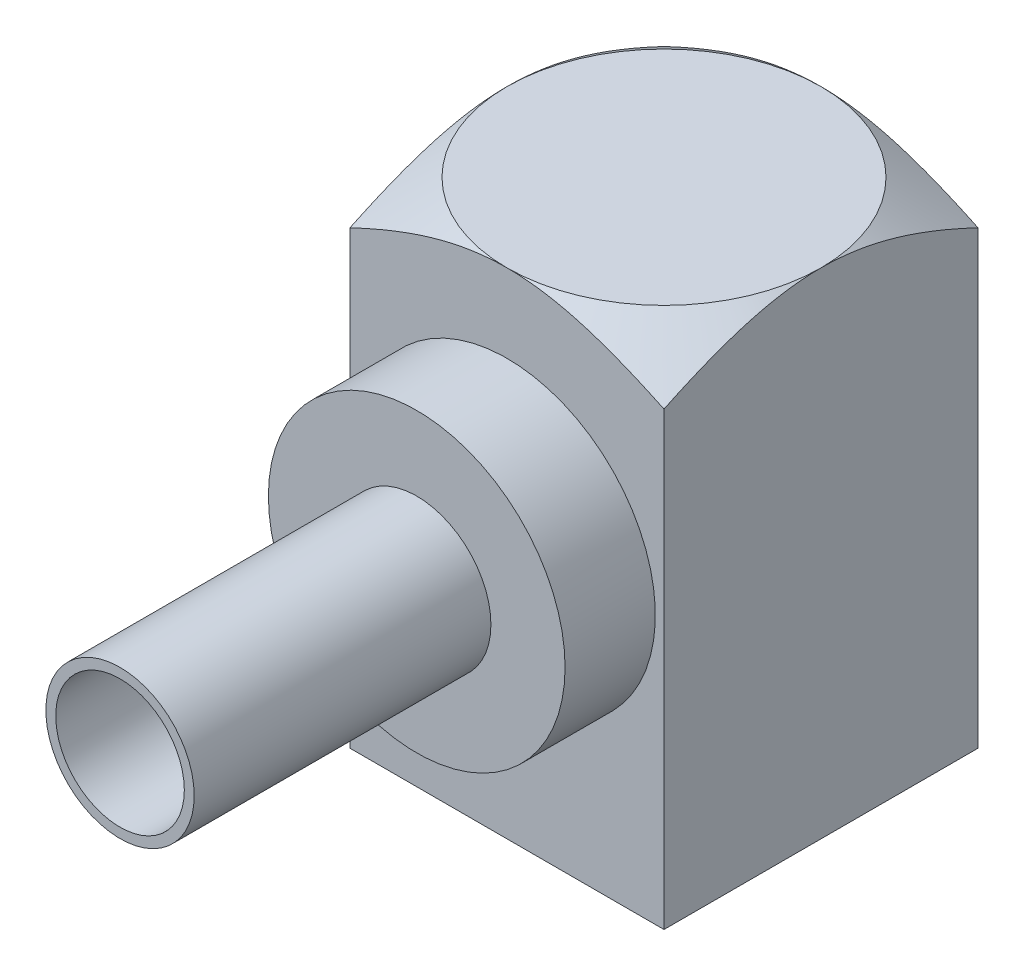
ISO-10303-21;
HEADER;
FILE_DESCRIPTION(('STEP AP214'),'2;1');
FILE_NAME('part.step','',(''),(''),'','','');
FILE_SCHEMA(('AUTOMOTIVE_DESIGN { 1 0 10303 214 1 1 1 1 }'));
ENDSEC;
DATA;
#1=APPLICATION_CONTEXT('core data for automotive mechanical design processes');
#2=APPLICATION_PROTOCOL_DEFINITION('international standard','automotive_design',2000,#1);
#3=PRODUCT_CONTEXT('',#1,'mechanical');
#4=PRODUCT('Part','Part','',(#3));
#5=PRODUCT_RELATED_PRODUCT_CATEGORY('part','',(#4));
#6=PRODUCT_DEFINITION_FORMATION('','',#4);
#7=PRODUCT_DEFINITION_CONTEXT('part definition',#1,'design');
#8=PRODUCT_DEFINITION('design','',#6,#7);
#9=PRODUCT_DEFINITION_SHAPE('','',#8);
#10=(LENGTH_UNIT() NAMED_UNIT(*) SI_UNIT(.MILLI.,.METRE.));
#11=(NAMED_UNIT(*) PLANE_ANGLE_UNIT() SI_UNIT($,.RADIAN.));
#12=(NAMED_UNIT(*) SI_UNIT($,.STERADIAN.) SOLID_ANGLE_UNIT());
#13=UNCERTAINTY_MEASURE_WITH_UNIT(LENGTH_MEASURE(1.E-05),#10,'distance_accuracy_value','');
#14=(GEOMETRIC_REPRESENTATION_CONTEXT(3) GLOBAL_UNCERTAINTY_ASSIGNED_CONTEXT((#13)) GLOBAL_UNIT_ASSIGNED_CONTEXT((#10,
#11,#12)) REPRESENTATION_CONTEXT('',''));
#15=CARTESIAN_POINT('',(0.,0.,0.));
#16=DIRECTION('',(0.,0.,1.));
#17=DIRECTION('',(1.,0.,0.));
#18=AXIS2_PLACEMENT_3D('',#15,#16,#17);
#19=CARTESIAN_POINT('',(0.,5.41672008937326,5.));
#20=DIRECTION('',(0.,0.,1.));
#21=DIRECTION('',(1.,0.,0.));
#22=AXIS2_PLACEMENT_3D('',#19,#20,#21);
#23=PLANE('',#22);
#24=CARTESIAN_POINT('',(0.,5.41672008937326,5.));
#25=DIRECTION('',(0.,0.,1.));
#26=DIRECTION('',(1.,0.,0.));
#27=AXIS2_PLACEMENT_3D('',#24,#25,#26);
#28=CIRCLE('',#27,3.);
#29=CARTESIAN_POINT('',(3.,5.41672008937326,5.));
#30=VERTEX_POINT('',#29);
#31=EDGE_CURVE('E115',#30,#30,#28,.T.);
#32=ORIENTED_EDGE('',*,*,#31,.T.);
#33=EDGE_LOOP('',(#32));
#34=FACE_BOUND('',#33,.T.);
#35=CARTESIAN_POINT('',(0.,5.41672008937326,5.));
#36=DIRECTION('',(0.,0.,1.));
#37=DIRECTION('',(1.,0.,0.));
#38=AXIS2_PLACEMENT_3D('',#35,#36,#37);
#39=CIRCLE('',#38,1.5);
#40=CARTESIAN_POINT('',(1.5,5.41672008937326,5.));
#41=VERTEX_POINT('',#40);
#42=EDGE_CURVE('E208',#41,#41,#39,.T.);
#43=ORIENTED_EDGE('',*,*,#42,.F.);
#44=EDGE_LOOP('',(#43));
#45=FACE_BOUND('',#44,.T.);
#46=ADVANCED_FACE('F37',(#34,#45),#23,.T.);
#47=CARTESIAN_POINT('',(-3.175,10.,3.175));
#48=DIRECTION('',(0.,0.,-1.));
#49=DIRECTION('',(-1.,0.,0.));
#50=AXIS2_PLACEMENT_3D('',#47,#48,#49);
#51=PLANE('',#50);
#52=CARTESIAN_POINT('',(-6.32032641205396,7.37645000380084,3.175));
#53=CARTESIAN_POINT('',(-6.16895218492663,7.46747736521302,3.175));
#54=CARTESIAN_POINT('',(-6.01729661457983,7.55804126731745,3.175));
#55=CARTESIAN_POINT('',(-5.71327727289685,7.73799657380302,3.175));
#56=CARTESIAN_POINT('',(-5.56091345194097,7.82738789430431,3.175));
#57=CARTESIAN_POINT('',(-5.25493662775485,8.00498144862305,3.175));
#58=CARTESIAN_POINT('',(-5.10132135013916,8.09317977133449,3.175));
#59=CARTESIAN_POINT('',(-4.79307746216385,8.26778078099713,3.175));
#60=CARTESIAN_POINT('',(-4.63844887929924,8.35418351640659,3.175));
#61=CARTESIAN_POINT('',(-4.31663848026104,8.53094317548595,3.175));
#62=CARTESIAN_POINT('',(-4.14936274176758,8.62112965696902,3.175));
#63=CARTESIAN_POINT('',(-3.81302897277108,8.79811211497813,3.175));
#64=CARTESIAN_POINT('',(-3.64397102070342,8.88490823992954,3.175));
#65=CARTESIAN_POINT('',(-3.30376953024048,9.05392430309139,3.175));
#66=CARTESIAN_POINT('',(-3.13262812412677,9.13614850741251,3.175));
#67=CARTESIAN_POINT('',(-2.7875723320921,9.29451994890731,3.175));
#68=CARTESIAN_POINT('',(-2.61365850904715,9.37066840123643,3.175));
#69=CARTESIAN_POINT('',(-2.26492511795205,9.51362031801977,3.175));
#70=CARTESIAN_POINT('',(-2.09015506059304,9.58054304878613,3.175));
#71=CARTESIAN_POINT('',(-1.73668399550348,9.70333816508626,3.175));
#72=CARTESIAN_POINT('',(-1.55798270561569,9.75920975454965,3.175));
#73=CARTESIAN_POINT('',(-1.20067539481676,9.85490038588348,3.175));
#74=CARTESIAN_POINT('',(-1.02216355180625,9.89506210925511,3.175));
#75=CARTESIAN_POINT('',(-0.661986637883504,9.95717565461538,3.175));
#76=CARTESIAN_POINT('',(-0.480323595787676,9.97913877925976,3.175));
#77=CARTESIAN_POINT('',(-0.138404711679182,10.0006476267351,3.175));
#78=CARTESIAN_POINT('',(0.021694939968571,10.0026478318936,3.175));
#79=CARTESIAN_POINT('',(0.341252043894645,9.99037663659094,3.175));
#80=CARTESIAN_POINT('',(0.500709483791802,9.97610492391722,3.175));
#81=CARTESIAN_POINT('',(0.821131894061709,9.93227931512734,3.175));
#82=CARTESIAN_POINT('',(0.982049647979089,9.90238773672851,3.175));
#83=CARTESIAN_POINT('',(1.221166545973,9.84794754910515,3.175));
#84=CARTESIAN_POINT('',(1.30050836014319,9.82819632996262,3.175));
#85=CARTESIAN_POINT('',(1.45842552604471,9.78583900422348,3.175));
#86=CARTESIAN_POINT('',(1.53700089928035,9.76323297797484,3.175));
#87=CARTESIAN_POINT('',(1.8558788903623,9.66593593739176,3.175));
#88=CARTESIAN_POINT('',(2.09295134972969,9.58062813296855,3.175));
#89=CARTESIAN_POINT('',(2.56094555143089,9.39443577065133,3.175));
#90=CARTESIAN_POINT('',(2.79186022810245,9.29353415153339,3.175));
#91=CARTESIAN_POINT('',(3.2499816344048,9.08100085461568,3.175));
#92=CARTESIAN_POINT('',(3.47716562434901,8.96932062327403,3.175));
#93=CARTESIAN_POINT('',(3.92783811566259,8.7390546036212,3.175));
#94=CARTESIAN_POINT('',(4.15132823276525,8.62047194295386,3.175));
#95=CARTESIAN_POINT('',(4.57639379829241,8.38894881114961,3.175));
#96=CARTESIAN_POINT('',(4.7781894126206,8.27641043331177,3.175));
#97=CARTESIAN_POINT('',(5.18010130008581,8.04832555810753,3.175));
#98=CARTESIAN_POINT('',(5.38021736271109,7.93277869089403,3.175));
#99=CARTESIAN_POINT('',(5.77701955512814,7.70066168235369,3.175));
#100=CARTESIAN_POINT('',(5.97371958735508,7.58411524051035,3.175));
#101=CARTESIAN_POINT('',(6.36603959509545,7.34930901622095,3.175));
#102=CARTESIAN_POINT('',(6.56165978715509,7.23104959590592,3.175));
#103=CARTESIAN_POINT('',(6.75688863902531,7.11215670594293,3.175));
#104=B_SPLINE_CURVE_WITH_KNOTS('',3,(#52,#53,#54,#55,#56,#57,#58,#59,#60,#61,#62,#63,#64,#65,
#66,#67,#68,#69,#70,#71,#72,#73,#74,#75,#76,#77,#78,#79,#80,#81,#82,#83,#84,#85,#86,#87,#88,#89,
#90,#91,#92,#93,#94,#95,#96,#97,#98,#99,#100,#101,#102,#103),.UNSPECIFIED.,.F.,.F.,(4,2,2,2,2,2,
2,2,2,2,2,2,2,2,2,2,2,2,2,2,2,2,2,2,2,4),(0.,0.52990936457279,1.05985643137924,1.59124983492546,
2.12262887886825,2.69271611059043,3.2627783566057,3.83229942253689,4.40170629676645,
4.96287478089985,5.52408367416619,6.072258563716,6.62009274098966,7.0995938564829,
7.57910417241819,8.06943813301367,8.31468542342756,8.55992581294548,9.31478214552242,
10.0704702924858,10.8297373148541,11.5886629349661,12.2817948764114,12.9750124337926,
13.6609078803342,14.3466603826962),.UNSPECIFIED.);
#105=CARTESIAN_POINT('',(-3.175,9.11484983095224,3.175));
#106=VERTEX_POINT('',#105);
#107=CARTESIAN_POINT('',(0.,10.,3.175));
#108=VERTEX_POINT('',#107);
#109=EDGE_CURVE('E153',#106,#108,#104,.T.);
#110=ORIENTED_EDGE('',*,*,#109,.F.);
#111=DIRECTION('',(0.,-1.,0.));
#112=VECTOR('',#111,1.);
#113=CARTESIAN_POINT('',(-3.175,10.,3.175));
#114=LINE('',#113,#112);
#115=CARTESIAN_POINT('',(-3.175,0.,3.175));
#116=VERTEX_POINT('',#115);
#117=EDGE_CURVE('E223',#106,#116,#114,.T.);
#118=ORIENTED_EDGE('',*,*,#117,.T.);
#119=DIRECTION('',(1.,0.,0.));
#120=VECTOR('',#119,1.);
#121=CARTESIAN_POINT('',(-3.175,0.,3.175));
#122=LINE('',#121,#120);
#123=CARTESIAN_POINT('',(3.175,0.,3.175));
#124=VERTEX_POINT('',#123);
#125=EDGE_CURVE('E226',#116,#124,#122,.T.);
#126=ORIENTED_EDGE('',*,*,#125,.T.);
#127=DIRECTION('',(0.,-1.,0.));
#128=VECTOR('',#127,1.);
#129=CARTESIAN_POINT('',(3.175,10.,3.175));
#130=LINE('',#129,#128);
#131=CARTESIAN_POINT('',(3.175,9.11484983095224,3.175));
#132=VERTEX_POINT('',#131);
#133=EDGE_CURVE('E61',#132,#124,#130,.T.);
#134=ORIENTED_EDGE('',*,*,#133,.F.);
#135=EDGE_CURVE('E99',#108,#132,#104,.T.);
#136=ORIENTED_EDGE('',*,*,#135,.F.);
#137=EDGE_LOOP('',(#110,#118,#126,#134,#136));
#138=FACE_BOUND('',#137,.T.);
#139=CARTESIAN_POINT('',(0.,5.41672008937326,3.175));
#140=DIRECTION('',(0.,0.,-1.));
#141=DIRECTION('',(-1.,0.,0.));
#142=AXIS2_PLACEMENT_3D('',#139,#140,#141);
#143=CIRCLE('',#142,3.);
#144=CARTESIAN_POINT('',(-3.,5.41672008937326,3.175));
#145=VERTEX_POINT('',#144);
#146=EDGE_CURVE('E46',#145,#145,#143,.F.);
#147=ORIENTED_EDGE('',*,*,#146,.F.);
#148=EDGE_LOOP('',(#147));
#149=FACE_BOUND('',#148,.T.);
#150=ADVANCED_FACE('F160',(#138,#149),#51,.F.);
#151=CARTESIAN_POINT('',(3.175,10.,3.175));
#152=DIRECTION('',(-1.,0.,0.));
#153=DIRECTION('',(0.,0.,1.));
#154=AXIS2_PLACEMENT_3D('',#151,#152,#153);
#155=PLANE('',#154);
#156=CARTESIAN_POINT('',(3.175,7.37645000380084,-6.32032641205396));
#157=CARTESIAN_POINT('',(3.175,7.46747736521302,-6.16895218492663));
#158=CARTESIAN_POINT('',(3.175,7.55804126731745,-6.01729661457983));
#159=CARTESIAN_POINT('',(3.175,7.73799657380302,-5.71327727289685));
#160=CARTESIAN_POINT('',(3.175,7.82738789430431,-5.56091345194096));
#161=CARTESIAN_POINT('',(3.175,8.00498144862306,-5.25493662775485));
#162=CARTESIAN_POINT('',(3.175,8.09317977133449,-5.10132135013916));
#163=CARTESIAN_POINT('',(3.175,8.26778078099713,-4.79307746216384));
#164=CARTESIAN_POINT('',(3.175,8.35418351640659,-4.63844887929923));
#165=CARTESIAN_POINT('',(3.175,8.53094317548595,-4.31663848026104));
#166=CARTESIAN_POINT('',(3.175,8.62112965696902,-4.14936274176758));
#167=CARTESIAN_POINT('',(3.175,8.79811211497813,-3.81302897277108));
#168=CARTESIAN_POINT('',(3.175,8.88490823992955,-3.64397102070342));
#169=CARTESIAN_POINT('',(3.175,9.05392430309139,-3.30376953024048));
#170=CARTESIAN_POINT('',(3.175,9.13614850741251,-3.13262812412677));
#171=CARTESIAN_POINT('',(3.175,9.29451994890731,-2.7875723320921));
#172=CARTESIAN_POINT('',(3.175,9.37066840123643,-2.61365850904715));
#173=CARTESIAN_POINT('',(3.175,9.51362031801977,-2.26492511795205));
#174=CARTESIAN_POINT('',(3.175,9.58054304878613,-2.09015506059304));
#175=CARTESIAN_POINT('',(3.175,9.70333816508626,-1.73668399550348));
#176=CARTESIAN_POINT('',(3.175,9.75920975454965,-1.55798270561569));
#177=CARTESIAN_POINT('',(3.175,9.85490038588348,-1.20067539481676));
#178=CARTESIAN_POINT('',(3.175,9.89506210925511,-1.02216355180625));
#179=CARTESIAN_POINT('',(3.175,9.95717565461538,-0.661986637883504));
#180=CARTESIAN_POINT('',(3.175,9.97913877925976,-0.480323595787676));
#181=CARTESIAN_POINT('',(3.175,10.0006476267351,-0.138404711679183));
#182=CARTESIAN_POINT('',(3.175,10.0026478318936,0.0216949399685706));
#183=CARTESIAN_POINT('',(3.175,9.99037663659094,0.341252043894644));
#184=CARTESIAN_POINT('',(3.175,9.97610492391722,0.500709483791803));
#185=CARTESIAN_POINT('',(3.175,9.93227931512734,0.821131894061709));
#186=CARTESIAN_POINT('',(3.175,9.90238773672851,0.98204964797909));
#187=CARTESIAN_POINT('',(3.175,9.84794754910515,1.221166545973));
#188=CARTESIAN_POINT('',(3.175,9.82819632996262,1.30050836014319));
#189=CARTESIAN_POINT('',(3.175,9.78583900422349,1.45842552604471));
#190=CARTESIAN_POINT('',(3.175,9.76323297797484,1.53700089928035));
#191=CARTESIAN_POINT('',(3.175,9.66593593739176,1.8558788903623));
#192=CARTESIAN_POINT('',(3.175,9.58062813296855,2.09295134972969));
#193=CARTESIAN_POINT('',(3.175,9.39443577065133,2.56094555143089));
#194=CARTESIAN_POINT('',(3.175,9.29353415153339,2.79186022810245));
#195=CARTESIAN_POINT('',(3.175,9.08100085461568,3.2499816344048));
#196=CARTESIAN_POINT('',(3.175,8.96932062327403,3.47716562434901));
#197=CARTESIAN_POINT('',(3.175,8.7390546036212,3.92783811566259));
#198=CARTESIAN_POINT('',(3.175,8.62047194295386,4.15132823276525));
#199=CARTESIAN_POINT('',(3.175,8.38894881114962,4.57639379829241));
#200=CARTESIAN_POINT('',(3.175,8.27641043331178,4.77818941262059));
#201=CARTESIAN_POINT('',(3.175,8.04832555810753,5.1801013000858));
#202=CARTESIAN_POINT('',(3.175,7.93277869089403,5.38021736271108));
#203=CARTESIAN_POINT('',(3.175,7.70066168235369,5.77701955512814));
#204=CARTESIAN_POINT('',(3.175,7.58411524051035,5.97371958735508));
#205=CARTESIAN_POINT('',(3.175,7.34930901622096,6.36603959509544));
#206=CARTESIAN_POINT('',(3.175,7.23104959590592,6.56165978715508));
#207=CARTESIAN_POINT('',(3.175,7.11215670594293,6.75688863902531));
#208=B_SPLINE_CURVE_WITH_KNOTS('',3,(#156,#157,#158,#159,#160,#161,#162,#163,#164,#165,#166,
#167,#168,#169,#170,#171,#172,#173,#174,#175,#176,#177,#178,#179,#180,#181,#182,#183,#184,#185,
#186,#187,#188,#189,#190,#191,#192,#193,#194,#195,#196,#197,#198,#199,#200,#201,#202,#203,#204,
#205,#206,#207),.UNSPECIFIED.,.F.,.F.,(4,2,2,2,2,2,2,2,2,2,2,2,2,2,2,2,2,2,2,2,2,2,2,2,2,4),(0.,
0.529909364572791,1.05985643137924,1.59124983492547,2.12262887886826,2.69271611059043,
3.2627783566057,3.83229942253689,4.40170629676645,4.96287478089985,5.52408367416619,
6.072258563716,6.62009274098966,7.0995938564829,7.57910417241819,8.06943813301367,
8.31468542342757,8.55992581294548,9.31478214552242,10.0704702924858,10.8297373148541,
11.5886629349661,12.2817948764114,12.9750124337926,13.6609078803342,14.3466603826962),.UNSPECIFIED.);
#209=CARTESIAN_POINT('',(3.175,10.,0.));
#210=VERTEX_POINT('',#209);
#211=EDGE_CURVE('E94',#132,#210,#208,.F.);
#212=ORIENTED_EDGE('',*,*,#211,.F.);
#213=ORIENTED_EDGE('',*,*,#133,.T.);
#214=DIRECTION('',(0.,0.,-1.));
#215=VECTOR('',#214,1.);
#216=CARTESIAN_POINT('',(3.175,0.,3.175));
#217=LINE('',#216,#215);
#218=CARTESIAN_POINT('',(3.175,0.,-3.175));
#219=VERTEX_POINT('',#218);
#220=EDGE_CURVE('E101',#124,#219,#217,.T.);
#221=ORIENTED_EDGE('',*,*,#220,.T.);
#222=DIRECTION('',(0.,-1.,0.));
#223=VECTOR('',#222,1.);
#224=CARTESIAN_POINT('',(3.175,10.,-3.175));
#225=LINE('',#224,#223);
#226=CARTESIAN_POINT('',(3.175,9.11484983095224,-3.175));
#227=VERTEX_POINT('',#226);
#228=EDGE_CURVE('E118',#227,#219,#225,.T.);
#229=ORIENTED_EDGE('',*,*,#228,.F.);
#230=EDGE_CURVE('E102',#210,#227,#208,.F.);
#231=ORIENTED_EDGE('',*,*,#230,.F.);
#232=EDGE_LOOP('',(#212,#213,#221,#229,#231));
#233=FACE_BOUND('',#232,.T.);
#234=ADVANCED_FACE('F39',(#233),#155,.F.);
#235=CARTESIAN_POINT('',(3.175,10.,-3.175));
#236=DIRECTION('',(0.,0.,1.));
#237=DIRECTION('',(1.,0.,0.));
#238=AXIS2_PLACEMENT_3D('',#235,#236,#237);
#239=PLANE('',#238);
#240=CARTESIAN_POINT('',(-6.32032641205396,7.37645000380084,-3.175));
#241=CARTESIAN_POINT('',(-6.16895218492664,7.46747736521301,-3.175));
#242=CARTESIAN_POINT('',(-6.01729661457983,7.55804126731745,-3.175));
#243=CARTESIAN_POINT('',(-5.71327727289685,7.73799657380302,-3.175));
#244=CARTESIAN_POINT('',(-5.56091345194097,7.82738789430431,-3.175));
#245=CARTESIAN_POINT('',(-5.25493662775485,8.00498144862305,-3.175));
#246=CARTESIAN_POINT('',(-5.10132135013916,8.09317977133449,-3.175));
#247=CARTESIAN_POINT('',(-4.79307746216385,8.26778078099713,-3.175));
#248=CARTESIAN_POINT('',(-4.63844887929924,8.35418351640659,-3.175));
#249=CARTESIAN_POINT('',(-4.31663848026104,8.53094317548595,-3.175));
#250=CARTESIAN_POINT('',(-4.14936274176758,8.62112965696902,-3.175));
#251=CARTESIAN_POINT('',(-3.81302897277108,8.79811211497813,-3.175));
#252=CARTESIAN_POINT('',(-3.64397102070341,8.88490823992954,-3.175));
#253=CARTESIAN_POINT('',(-3.30376953024048,9.05392430309138,-3.175));
#254=CARTESIAN_POINT('',(-3.13262812412677,9.13614850741251,-3.175));
#255=CARTESIAN_POINT('',(-2.7875723320921,9.29451994890731,-3.175));
#256=CARTESIAN_POINT('',(-2.61365850904715,9.37066840123643,-3.175));
#257=CARTESIAN_POINT('',(-2.26492511795205,9.51362031801976,-3.175));
#258=CARTESIAN_POINT('',(-2.09015506059304,9.58054304878613,-3.175));
#259=CARTESIAN_POINT('',(-1.73668399550348,9.70333816508626,-3.175));
#260=CARTESIAN_POINT('',(-1.55798270561569,9.75920975454965,-3.175));
#261=CARTESIAN_POINT('',(-1.20067539481676,9.85490038588348,-3.175));
#262=CARTESIAN_POINT('',(-1.02216355180625,9.89506210925511,-3.175));
#263=CARTESIAN_POINT('',(-0.661986637883501,9.95717565461538,-3.175));
#264=CARTESIAN_POINT('',(-0.480323595787673,9.97913877925976,-3.175));
#265=CARTESIAN_POINT('',(-0.13840471167918,10.0006476267351,-3.175));
#266=CARTESIAN_POINT('',(0.0216949399685735,10.0026478318936,-3.175));
#267=CARTESIAN_POINT('',(0.341252043894648,9.99037663659093,-3.175));
#268=CARTESIAN_POINT('',(0.500709483791806,9.97610492391722,-3.175));
#269=CARTESIAN_POINT('',(0.821131894061714,9.93227931512733,-3.175));
#270=CARTESIAN_POINT('',(0.982049647979094,9.90238773672851,-3.175));
#271=CARTESIAN_POINT('',(1.22116654597301,9.84794754910515,-3.175));
#272=CARTESIAN_POINT('',(1.30050836014319,9.82819632996261,-3.175));
#273=CARTESIAN_POINT('',(1.45842552604472,9.78583900422348,-3.175));
#274=CARTESIAN_POINT('',(1.53700089928035,9.76323297797483,-3.175));
#275=CARTESIAN_POINT('',(1.8558788903623,9.66593593739175,-3.175));
#276=CARTESIAN_POINT('',(2.0929513497297,9.58062813296854,-3.175));
#277=CARTESIAN_POINT('',(2.56094555143089,9.39443577065133,-3.175));
#278=CARTESIAN_POINT('',(2.79186022810246,9.29353415153338,-3.175));
#279=CARTESIAN_POINT('',(3.2499816344048,9.08100085461568,-3.175));
#280=CARTESIAN_POINT('',(3.47716562434901,8.96932062327403,-3.175));
#281=CARTESIAN_POINT('',(3.9278381156626,8.7390546036212,-3.175));
#282=CARTESIAN_POINT('',(4.15132823276526,8.62047194295386,-3.175));
#283=CARTESIAN_POINT('',(4.57639379829242,8.38894881114961,-3.175));
#284=CARTESIAN_POINT('',(4.7781894126206,8.27641043331177,-3.175));
#285=CARTESIAN_POINT('',(5.18010130008581,8.04832555810753,-3.175));
#286=CARTESIAN_POINT('',(5.38021736271109,7.93277869089402,-3.175));
#287=CARTESIAN_POINT('',(5.77701955512815,7.70066168235368,-3.175));
#288=CARTESIAN_POINT('',(5.97371958735509,7.58411524051034,-3.175));
#289=CARTESIAN_POINT('',(6.36603959509546,7.34930901622094,-3.175));
#290=CARTESIAN_POINT('',(6.5616597871551,7.23104959590591,-3.175));
#291=CARTESIAN_POINT('',(6.75688863902533,7.11215670594292,-3.175));
#292=B_SPLINE_CURVE_WITH_KNOTS('',3,(#240,#241,#242,#243,#244,#245,#246,#247,#248,#249,#250,
#251,#252,#253,#254,#255,#256,#257,#258,#259,#260,#261,#262,#263,#264,#265,#266,#267,#268,#269,
#270,#271,#272,#273,#274,#275,#276,#277,#278,#279,#280,#281,#282,#283,#284,#285,#286,#287,#288,
#289,#290,#291),.UNSPECIFIED.,.F.,.F.,(4,2,2,2,2,2,2,2,2,2,2,2,2,2,2,2,2,2,2,2,2,2,2,2,2,4),(0.,
0.529909364572791,1.05985643137924,1.59124983492547,2.12262887886826,2.69271611059043,
3.26277835660571,3.83229942253689,4.40170629676645,4.96287478089986,5.52408367416619,
6.07225856371601,6.62009274098967,7.09959385648291,7.5791041724182,8.06943813301368,
8.31468542342757,8.55992581294549,9.31478214552243,10.0704702924858,10.8297373148541,
11.5886629349661,12.2817948764114,12.9750124337927,13.6609078803342,14.3466603826963),.UNSPECIFIED.);
#293=CARTESIAN_POINT('',(0.,10.,-3.175));
#294=VERTEX_POINT('',#293);
#295=EDGE_CURVE('E109',#227,#294,#292,.F.);
#296=ORIENTED_EDGE('',*,*,#295,.F.);
#297=ORIENTED_EDGE('',*,*,#228,.T.);
#298=DIRECTION('',(-1.,0.,0.));
#299=VECTOR('',#298,1.);
#300=CARTESIAN_POINT('',(3.175,0.,-3.175));
#301=LINE('',#300,#299);
#302=CARTESIAN_POINT('',(-3.175,0.,-3.175));
#303=VERTEX_POINT('',#302);
#304=EDGE_CURVE('E230',#219,#303,#301,.T.);
#305=ORIENTED_EDGE('',*,*,#304,.T.);
#306=DIRECTION('',(0.,-1.,0.));
#307=VECTOR('',#306,1.);
#308=CARTESIAN_POINT('',(-3.175,10.,-3.175));
#309=LINE('',#308,#307);
#310=CARTESIAN_POINT('',(-3.175,9.11484983095224,-3.175));
#311=VERTEX_POINT('',#310);
#312=EDGE_CURVE('E221',#311,#303,#309,.T.);
#313=ORIENTED_EDGE('',*,*,#312,.F.);
#314=EDGE_CURVE('E119',#294,#311,#292,.F.);
#315=ORIENTED_EDGE('',*,*,#314,.F.);
#316=EDGE_LOOP('',(#296,#297,#305,#313,#315));
#317=FACE_BOUND('',#316,.T.);
#318=ADVANCED_FACE('F158',(#317),#239,.F.);
#319=CARTESIAN_POINT('',(-3.175,10.,-3.175));
#320=DIRECTION('',(1.,0.,0.));
#321=DIRECTION('',(0.,0.,-1.));
#322=AXIS2_PLACEMENT_3D('',#319,#320,#321);
#323=PLANE('',#322);
#324=CARTESIAN_POINT('',(-3.175,7.37645000380084,-6.32032641205396));
#325=CARTESIAN_POINT('',(-3.175,7.46747736521301,-6.16895218492664));
#326=CARTESIAN_POINT('',(-3.175,7.55804126731745,-6.01729661457983));
#327=CARTESIAN_POINT('',(-3.175,7.73799657380302,-5.71327727289685));
#328=CARTESIAN_POINT('',(-3.175,7.82738789430431,-5.56091345194097));
#329=CARTESIAN_POINT('',(-3.175,8.00498144862305,-5.25493662775485));
#330=CARTESIAN_POINT('',(-3.175,8.09317977133449,-5.10132135013916));
#331=CARTESIAN_POINT('',(-3.175,8.26778078099713,-4.79307746216385));
#332=CARTESIAN_POINT('',(-3.175,8.35418351640658,-4.63844887929924));
#333=CARTESIAN_POINT('',(-3.175,8.53094317548595,-4.31663848026104));
#334=CARTESIAN_POINT('',(-3.175,8.62112965696902,-4.14936274176759));
#335=CARTESIAN_POINT('',(-3.175,8.79811211497813,-3.81302897277108));
#336=CARTESIAN_POINT('',(-3.175,8.88490823992954,-3.64397102070342));
#337=CARTESIAN_POINT('',(-3.175,9.05392430309138,-3.30376953024048));
#338=CARTESIAN_POINT('',(-3.175,9.13614850741251,-3.13262812412677));
#339=CARTESIAN_POINT('',(-3.175,9.29451994890731,-2.7875723320921));
#340=CARTESIAN_POINT('',(-3.175,9.37066840123643,-2.61365850904715));
#341=CARTESIAN_POINT('',(-3.175,9.51362031801976,-2.26492511795205));
#342=CARTESIAN_POINT('',(-3.175,9.58054304878613,-2.09015506059304));
#343=CARTESIAN_POINT('',(-3.175,9.70333816508626,-1.73668399550348));
#344=CARTESIAN_POINT('',(-3.175,9.75920975454965,-1.55798270561569));
#345=CARTESIAN_POINT('',(-3.175,9.85490038588348,-1.20067539481676));
#346=CARTESIAN_POINT('',(-3.175,9.89506210925511,-1.02216355180625));
#347=CARTESIAN_POINT('',(-3.175,9.95717565461538,-0.661986637883501));
#348=CARTESIAN_POINT('',(-3.175,9.97913877925976,-0.480323595787673));
#349=CARTESIAN_POINT('',(-3.175,10.0006476267351,-0.13840471167918));
#350=CARTESIAN_POINT('',(-3.175,10.0026478318936,0.0216949399685733));
#351=CARTESIAN_POINT('',(-3.175,9.99037663659093,0.341252043894647));
#352=CARTESIAN_POINT('',(-3.175,9.97610492391722,0.500709483791805));
#353=CARTESIAN_POINT('',(-3.175,9.93227931512733,0.821131894061713));
#354=CARTESIAN_POINT('',(-3.175,9.90238773672851,0.982049647979093));
#355=CARTESIAN_POINT('',(-3.175,9.84794754910515,1.22116654597301));
#356=CARTESIAN_POINT('',(-3.175,9.82819632996261,1.30050836014319));
#357=CARTESIAN_POINT('',(-3.175,9.78583900422348,1.45842552604472));
#358=CARTESIAN_POINT('',(-3.175,9.76323297797483,1.53700089928035));
#359=CARTESIAN_POINT('',(-3.175,9.66593593739175,1.8558788903623));
#360=CARTESIAN_POINT('',(-3.175,9.58062813296854,2.0929513497297));
#361=CARTESIAN_POINT('',(-3.175,9.39443577065133,2.56094555143089));
#362=CARTESIAN_POINT('',(-3.175,9.29353415153338,2.79186022810246));
#363=CARTESIAN_POINT('',(-3.175,9.08100085461568,3.24998163440481));
#364=CARTESIAN_POINT('',(-3.175,8.96932062327403,3.47716562434901));
#365=CARTESIAN_POINT('',(-3.175,8.7390546036212,3.9278381156626));
#366=CARTESIAN_POINT('',(-3.175,8.62047194295386,4.15132823276526));
#367=CARTESIAN_POINT('',(-3.175,8.38894881114961,4.57639379829242));
#368=CARTESIAN_POINT('',(-3.175,8.27641043331177,4.77818941262061));
#369=CARTESIAN_POINT('',(-3.175,8.04832555810752,5.18010130008582));
#370=CARTESIAN_POINT('',(-3.175,7.93277869089402,5.38021736271109));
#371=CARTESIAN_POINT('',(-3.175,7.70066168235368,5.77701955512815));
#372=CARTESIAN_POINT('',(-3.175,7.58411524051034,5.9737195873551));
#373=CARTESIAN_POINT('',(-3.175,7.34930901622095,6.36603959509546));
#374=CARTESIAN_POINT('',(-3.175,7.23104959590591,6.5616597871551));
#375=CARTESIAN_POINT('',(-3.175,7.11215670594292,6.75688863902533));
#376=B_SPLINE_CURVE_WITH_KNOTS('',3,(#324,#325,#326,#327,#328,#329,#330,#331,#332,#333,#334,
#335,#336,#337,#338,#339,#340,#341,#342,#343,#344,#345,#346,#347,#348,#349,#350,#351,#352,#353,
#354,#355,#356,#357,#358,#359,#360,#361,#362,#363,#364,#365,#366,#367,#368,#369,#370,#371,#372,
#373,#374,#375),.UNSPECIFIED.,.F.,.F.,(4,2,2,2,2,2,2,2,2,2,2,2,2,2,2,2,2,2,2,2,2,2,2,2,2,4),(0.,
0.529909364572791,1.05985643137924,1.59124983492547,2.12262887886826,2.69271611059043,
3.26277835660571,3.83229942253689,4.40170629676645,4.96287478089986,5.52408367416619,
6.07225856371601,6.62009274098967,7.09959385648291,7.57910417241819,8.06943813301368,
8.31468542342757,8.55992581294548,9.31478214552243,10.0704702924858,10.8297373148541,
11.5886629349661,12.2817948764114,12.9750124337927,13.6609078803342,14.3466603826963),.UNSPECIFIED.);
#377=CARTESIAN_POINT('',(-3.175,10.,0.));
#378=VERTEX_POINT('',#377);
#379=EDGE_CURVE('E152',#311,#378,#376,.T.);
#380=ORIENTED_EDGE('',*,*,#379,.F.);
#381=ORIENTED_EDGE('',*,*,#312,.T.);
#382=DIRECTION('',(0.,0.,1.));
#383=VECTOR('',#382,1.);
#384=CARTESIAN_POINT('',(-3.175,0.,-3.175));
#385=LINE('',#384,#383);
#386=EDGE_CURVE('E228',#303,#116,#385,.T.);
#387=ORIENTED_EDGE('',*,*,#386,.T.);
#388=ORIENTED_EDGE('',*,*,#117,.F.);
#389=EDGE_CURVE('E147',#378,#106,#376,.T.);
#390=ORIENTED_EDGE('',*,*,#389,.F.);
#391=EDGE_LOOP('',(#380,#381,#387,#388,#390));
#392=FACE_BOUND('',#391,.T.);
#393=ADVANCED_FACE('F154',(#392),#323,.F.);
#394=CARTESIAN_POINT('',(0.,0.,0.));
#395=DIRECTION('',(0.,1.,0.));
#396=DIRECTION('',(0.,0.,1.));
#397=AXIS2_PLACEMENT_3D('',#394,#395,#396);
#398=PLANE('',#397);
#399=ORIENTED_EDGE('',*,*,#220,.F.);
#400=ORIENTED_EDGE('',*,*,#125,.F.);
#401=ORIENTED_EDGE('',*,*,#386,.F.);
#402=ORIENTED_EDGE('',*,*,#304,.F.);
#403=EDGE_LOOP('',(#399,#400,#401,#402));
#404=FACE_BOUND('',#403,.T.);
#405=ADVANCED_FACE('F157',(#404),#398,.F.);
#406=CARTESIAN_POINT('',(0.,10.,0.));
#407=DIRECTION('',(0.,-1.,0.));
#408=DIRECTION('',(0.,0.,-1.));
#409=AXIS2_PLACEMENT_3D('',#406,#407,#408);
#410=CONICAL_SURFACE('',#409,3.175,0.97838581325611);
#411=ORIENTED_EDGE('',*,*,#389,.T.);
#412=ORIENTED_EDGE('',*,*,#109,.T.);
#413=CARTESIAN_POINT('',(0.,10.,0.));
#414=DIRECTION('',(0.,1.,0.));
#415=DIRECTION('',(0.,0.,1.));
#416=AXIS2_PLACEMENT_3D('',#413,#414,#415);
#417=CIRCLE('',#416,3.175);
#418=EDGE_CURVE('E53',#378,#108,#417,.T.);
#419=ORIENTED_EDGE('',*,*,#418,.F.);
#420=EDGE_LOOP('',(#411,#412,#419));
#421=FACE_BOUND('',#420,.T.);
#422=ADVANCED_FACE('F135',(#421),#410,.T.);
#423=ORIENTED_EDGE('',*,*,#314,.T.);
#424=ORIENTED_EDGE('',*,*,#379,.T.);
#425=EDGE_CURVE('E112',#294,#378,#417,.T.);
#426=ORIENTED_EDGE('',*,*,#425,.F.);
#427=EDGE_LOOP('',(#423,#424,#426));
#428=FACE_BOUND('',#427,.T.);
#429=ADVANCED_FACE('F242',(#428),#410,.T.);
#430=ORIENTED_EDGE('',*,*,#230,.T.);
#431=ORIENTED_EDGE('',*,*,#295,.T.);
#432=EDGE_CURVE('E106',#210,#294,#417,.T.);
#433=ORIENTED_EDGE('',*,*,#432,.F.);
#434=EDGE_LOOP('',(#430,#431,#433));
#435=FACE_BOUND('',#434,.T.);
#436=ADVANCED_FACE('F107',(#435),#410,.T.);
#437=ORIENTED_EDGE('',*,*,#211,.T.);
#438=CARTESIAN_POINT('',(0.,10.,0.));
#439=DIRECTION('',(0.,1.,0.));
#440=DIRECTION('',(0.,0.,1.));
#441=AXIS2_PLACEMENT_3D('',#438,#439,#440);
#442=CIRCLE('',#441,3.175);
#443=EDGE_CURVE('E97',#108,#210,#442,.T.);
#444=ORIENTED_EDGE('',*,*,#443,.F.);
#445=ORIENTED_EDGE('',*,*,#135,.T.);
#446=EDGE_LOOP('',(#437,#444,#445));
#447=FACE_BOUND('',#446,.T.);
#448=ADVANCED_FACE('F96',(#447),#410,.T.);
#449=CARTESIAN_POINT('',(0.,10.,0.));
#450=DIRECTION('',(0.,1.,0.));
#451=DIRECTION('',(0.,0.,1.));
#452=AXIS2_PLACEMENT_3D('',#449,#450,#451);
#453=PLANE('',#452);
#454=ORIENTED_EDGE('',*,*,#418,.T.);
#455=ORIENTED_EDGE('',*,*,#443,.T.);
#456=ORIENTED_EDGE('',*,*,#432,.T.);
#457=ORIENTED_EDGE('',*,*,#425,.T.);
#458=EDGE_LOOP('',(#454,#455,#456,#457));
#459=FACE_BOUND('',#458,.T.);
#460=ADVANCED_FACE('F114',(#459),#453,.T.);
#461=CARTESIAN_POINT('',(0.,5.41672008937326,5.));
#462=DIRECTION('',(0.,0.,-1.));
#463=DIRECTION('',(-1.,0.,0.));
#464=AXIS2_PLACEMENT_3D('',#461,#462,#463);
#465=CYLINDRICAL_SURFACE('',#464,3.);
#466=ORIENTED_EDGE('',*,*,#31,.F.);
#467=EDGE_LOOP('',(#466));
#468=FACE_BOUND('',#467,.T.);
#469=ORIENTED_EDGE('',*,*,#146,.T.);
#470=EDGE_LOOP('',(#469));
#471=FACE_BOUND('',#470,.T.);
#472=ADVANCED_FACE('F136',(#468,#471),#465,.T.);
#473=CARTESIAN_POINT('',(0.,5.41672008937326,11.));
#474=DIRECTION('',(0.,0.,1.));
#475=DIRECTION('',(1.,0.,0.));
#476=AXIS2_PLACEMENT_3D('',#473,#474,#475);
#477=PLANE('',#476);
#478=CARTESIAN_POINT('',(0.,5.41672008937326,11.));
#479=DIRECTION('',(0.,0.,1.));
#480=DIRECTION('',(1.,0.,0.));
#481=AXIS2_PLACEMENT_3D('',#478,#479,#480);
#482=CIRCLE('',#481,1.5);
#483=CARTESIAN_POINT('',(1.5,5.41672008937326,11.));
#484=VERTEX_POINT('',#483);
#485=EDGE_CURVE('E205',#484,#484,#482,.T.);
#486=ORIENTED_EDGE('',*,*,#485,.T.);
#487=EDGE_LOOP('',(#486));
#488=FACE_BOUND('',#487,.T.);
#489=CARTESIAN_POINT('',(0.,5.41672008937326,11.));
#490=DIRECTION('',(0.,0.,1.));
#491=DIRECTION('',(1.,0.,0.));
#492=AXIS2_PLACEMENT_3D('',#489,#490,#491);
#493=CIRCLE('',#492,1.3);
#494=CARTESIAN_POINT('',(1.3,5.41672008937326,11.));
#495=VERTEX_POINT('',#494);
#496=EDGE_CURVE('E207',#495,#495,#493,.T.);
#497=ORIENTED_EDGE('',*,*,#496,.F.);
#498=EDGE_LOOP('',(#497));
#499=FACE_BOUND('',#498,.T.);
#500=ADVANCED_FACE('F192',(#488,#499),#477,.T.);
#501=CARTESIAN_POINT('',(0.,5.41672008937326,11.));
#502=DIRECTION('',(0.,0.,-1.));
#503=DIRECTION('',(-1.,0.,0.));
#504=AXIS2_PLACEMENT_3D('',#501,#502,#503);
#505=CYLINDRICAL_SURFACE('',#504,1.5);
#506=ORIENTED_EDGE('',*,*,#485,.F.);
#507=EDGE_LOOP('',(#506));
#508=FACE_BOUND('',#507,.T.);
#509=ORIENTED_EDGE('',*,*,#42,.T.);
#510=EDGE_LOOP('',(#509));
#511=FACE_BOUND('',#510,.T.);
#512=ADVANCED_FACE('F184',(#508,#511),#505,.T.);
#513=CARTESIAN_POINT('',(0.,5.41672008937326,11.));
#514=DIRECTION('',(0.,0.,-1.));
#515=DIRECTION('',(-1.,0.,0.));
#516=AXIS2_PLACEMENT_3D('',#513,#514,#515);
#517=CYLINDRICAL_SURFACE('',#516,1.3);
#518=ORIENTED_EDGE('',*,*,#496,.T.);
#519=EDGE_LOOP('',(#518));
#520=FACE_BOUND('',#519,.T.);
#521=CARTESIAN_POINT('',(0.,5.41672008937326,5.));
#522=DIRECTION('',(0.,0.,1.));
#523=DIRECTION('',(1.,0.,0.));
#524=AXIS2_PLACEMENT_3D('',#521,#522,#523);
#525=CIRCLE('',#524,1.3);
#526=CARTESIAN_POINT('',(1.3,5.41672008937326,5.));
#527=VERTEX_POINT('',#526);
#528=EDGE_CURVE('E11',#527,#527,#525,.F.);
#529=ORIENTED_EDGE('',*,*,#528,.T.);
#530=EDGE_LOOP('',(#529));
#531=FACE_BOUND('',#530,.T.);
#532=ADVANCED_FACE('F179',(#520,#531),#517,.F.);
#533=ORIENTED_EDGE('',*,*,#528,.F.);
#534=EDGE_LOOP('',(#533));
#535=FACE_BOUND('',#534,.T.);
#536=ADVANCED_FACE('F170',(#535),#23,.T.);
#537=CLOSED_SHELL('',(#46,#150,#234,#318,#393,#405,#422,#429,#436,#448,#460,#472,#500,#512,#532,#536));
#538=MANIFOLD_SOLID_BREP('B2',#537);
#539=ADVANCED_BREP_SHAPE_REPRESENTATION('',(#18,#538),#14);
#540=SHAPE_DEFINITION_REPRESENTATION(#9,#539);
ENDSEC;
END-ISO-10303-21;
